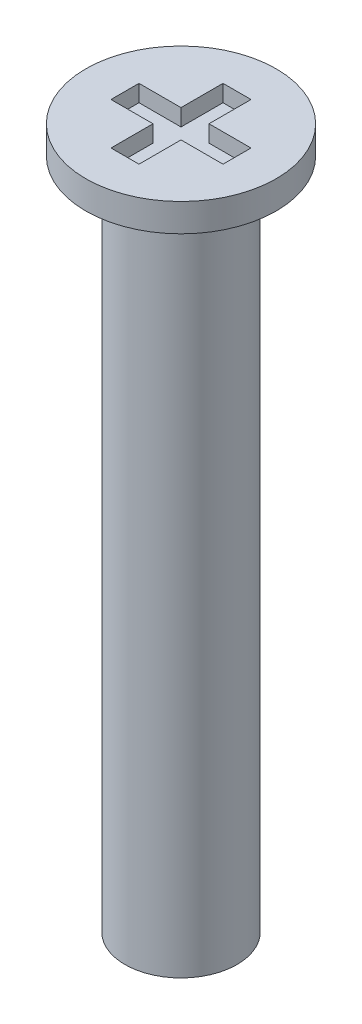
ISO-10303-21;
HEADER;
FILE_DESCRIPTION(('STEP AP214'),'2;1');
FILE_NAME('part.step','',(''),(''),'','','');
FILE_SCHEMA(('AUTOMOTIVE_DESIGN { 1 0 10303 214 1 1 1 1 }'));
ENDSEC;
DATA;
#1=APPLICATION_CONTEXT('core data for automotive mechanical design processes');
#2=APPLICATION_PROTOCOL_DEFINITION('international standard','automotive_design',2000,#1);
#3=PRODUCT_CONTEXT('',#1,'mechanical');
#4=PRODUCT('Part','Part','',(#3));
#5=PRODUCT_RELATED_PRODUCT_CATEGORY('part','',(#4));
#6=PRODUCT_DEFINITION_FORMATION('','',#4);
#7=PRODUCT_DEFINITION_CONTEXT('part definition',#1,'design');
#8=PRODUCT_DEFINITION('design','',#6,#7);
#9=PRODUCT_DEFINITION_SHAPE('','',#8);
#10=(LENGTH_UNIT() NAMED_UNIT(*) SI_UNIT(.MILLI.,.METRE.));
#11=(NAMED_UNIT(*) PLANE_ANGLE_UNIT() SI_UNIT($,.RADIAN.));
#12=(NAMED_UNIT(*) SI_UNIT($,.STERADIAN.) SOLID_ANGLE_UNIT());
#13=UNCERTAINTY_MEASURE_WITH_UNIT(LENGTH_MEASURE(1.E-05),#10,'distance_accuracy_value','');
#14=(GEOMETRIC_REPRESENTATION_CONTEXT(3) GLOBAL_UNCERTAINTY_ASSIGNED_CONTEXT((#13)) GLOBAL_UNIT_ASSIGNED_CONTEXT((#10,
#11,#12)) REPRESENTATION_CONTEXT('',''));
#15=CARTESIAN_POINT('',(0.,0.,0.));
#16=DIRECTION('',(0.,0.,1.));
#17=DIRECTION('',(1.,0.,0.));
#18=AXIS2_PLACEMENT_3D('',#15,#16,#17);
#19=CARTESIAN_POINT('',(0.,0.,0.));
#20=DIRECTION('',(0.,1.,0.));
#21=DIRECTION('',(0.,0.,1.));
#22=AXIS2_PLACEMENT_3D('',#19,#20,#21);
#23=PLANE('',#22);
#24=DIRECTION('',(-1.,0.,0.));
#25=VECTOR('',#24,1.);
#26=CARTESIAN_POINT('',(0.,0.,-0.25));
#27=LINE('',#26,#25);
#28=CARTESIAN_POINT('',(1.,0.,-0.249999999999997));
#29=VERTEX_POINT('',#28);
#30=CARTESIAN_POINT('',(0.25,0.,-0.249999999999999));
#31=VERTEX_POINT('',#30);
#32=EDGE_CURVE('E192',#29,#31,#27,.T.);
#33=ORIENTED_EDGE('',*,*,#32,.F.);
#34=DIRECTION('',(0.,0.,-1.));
#35=VECTOR('',#34,1.);
#36=CARTESIAN_POINT('',(1.,0.,-0.249999999999997));
#37=LINE('',#36,#35);
#38=CARTESIAN_POINT('',(0.999999999999999,0.,0.250000000000003));
#39=VERTEX_POINT('',#38);
#40=EDGE_CURVE('E138',#39,#29,#37,.T.);
#41=ORIENTED_EDGE('',*,*,#40,.F.);
#42=DIRECTION('',(1.,0.,0.));
#43=VECTOR('',#42,1.);
#44=CARTESIAN_POINT('',(0.,0.,0.25));
#45=LINE('',#44,#43);
#46=CARTESIAN_POINT('',(0.25,0.,0.250000000000003));
#47=VERTEX_POINT('',#46);
#48=EDGE_CURVE('E194',#47,#39,#45,.T.);
#49=ORIENTED_EDGE('',*,*,#48,.F.);
#50=DIRECTION('',(0.,0.,-1.));
#51=VECTOR('',#50,1.);
#52=CARTESIAN_POINT('',(0.25,0.,0.));
#53=LINE('',#52,#51);
#54=CARTESIAN_POINT('',(0.25,0.,1.));
#55=VERTEX_POINT('',#54);
#56=EDGE_CURVE('E164',#55,#47,#53,.T.);
#57=ORIENTED_EDGE('',*,*,#56,.F.);
#58=DIRECTION('',(1.,0.,0.));
#59=VECTOR('',#58,1.);
#60=CARTESIAN_POINT('',(0.25,0.,1.));
#61=LINE('',#60,#59);
#62=CARTESIAN_POINT('',(-0.25,0.,1.));
#63=VERTEX_POINT('',#62);
#64=EDGE_CURVE('E168',#63,#55,#61,.T.);
#65=ORIENTED_EDGE('',*,*,#64,.F.);
#66=DIRECTION('',(0.,0.,1.));
#67=VECTOR('',#66,1.);
#68=CARTESIAN_POINT('',(-0.25,0.,0.));
#69=LINE('',#68,#67);
#70=CARTESIAN_POINT('',(-0.25,0.,0.249999999999998));
#71=VERTEX_POINT('',#70);
#72=EDGE_CURVE('E176',#71,#63,#69,.T.);
#73=ORIENTED_EDGE('',*,*,#72,.F.);
#74=DIRECTION('',(1.,0.,0.));
#75=VECTOR('',#74,1.);
#76=CARTESIAN_POINT('',(0.,0.,0.25));
#77=LINE('',#76,#75);
#78=CARTESIAN_POINT('',(-1.,0.,0.24999999999999));
#79=VERTEX_POINT('',#78);
#80=EDGE_CURVE('E157',#79,#71,#77,.T.);
#81=ORIENTED_EDGE('',*,*,#80,.F.);
#82=DIRECTION('',(0.,0.,1.));
#83=VECTOR('',#82,1.);
#84=CARTESIAN_POINT('',(-1.,0.,0.24999999999999));
#85=LINE('',#84,#83);
#86=CARTESIAN_POINT('',(-0.999999999999997,0.,-0.25000000000001));
#87=VERTEX_POINT('',#86);
#88=EDGE_CURVE('E154',#87,#79,#85,.T.);
#89=ORIENTED_EDGE('',*,*,#88,.F.);
#90=CARTESIAN_POINT('',(-0.25,0.,-0.250000000000001));
#91=VERTEX_POINT('',#90);
#92=EDGE_CURVE('E144',#91,#87,#27,.T.);
#93=ORIENTED_EDGE('',*,*,#92,.F.);
#94=DIRECTION('',(0.,0.,1.));
#95=VECTOR('',#94,1.);
#96=CARTESIAN_POINT('',(-0.25,0.,0.));
#97=LINE('',#96,#95);
#98=CARTESIAN_POINT('',(-0.25,0.,-1.));
#99=VERTEX_POINT('',#98);
#100=EDGE_CURVE('E206',#99,#91,#97,.T.);
#101=ORIENTED_EDGE('',*,*,#100,.F.);
#102=DIRECTION('',(-1.,0.,0.));
#103=VECTOR('',#102,1.);
#104=CARTESIAN_POINT('',(-0.25,0.,-1.));
#105=LINE('',#104,#103);
#106=CARTESIAN_POINT('',(0.25,0.,-1.));
#107=VERTEX_POINT('',#106);
#108=EDGE_CURVE('E209',#107,#99,#105,.T.);
#109=ORIENTED_EDGE('',*,*,#108,.F.);
#110=DIRECTION('',(0.,0.,-1.));
#111=VECTOR('',#110,1.);
#112=CARTESIAN_POINT('',(0.25,0.,0.));
#113=LINE('',#112,#111);
#114=EDGE_CURVE('E64',#31,#107,#113,.T.);
#115=ORIENTED_EDGE('',*,*,#114,.F.);
#116=EDGE_LOOP('',(#33,#41,#49,#57,#65,#73,#81,#89,#93,#101,#109,#115));
#117=FACE_BOUND('',#116,.T.);
#118=CARTESIAN_POINT('',(0.,0.,0.));
#119=DIRECTION('',(0.,-1.,0.));
#120=DIRECTION('',(0.,0.,-1.));
#121=AXIS2_PLACEMENT_3D('',#118,#119,#120);
#122=CIRCLE('',#121,1.7);
#123=CARTESIAN_POINT('',(0.,0.,-1.7));
#124=VERTEX_POINT('',#123);
#125=EDGE_CURVE('E11',#124,#124,#122,.T.);
#126=ORIENTED_EDGE('',*,*,#125,.F.);
#127=EDGE_LOOP('',(#126));
#128=FACE_BOUND('',#127,.T.);
#129=ADVANCED_FACE('F36',(#117,#128),#23,.T.);
#130=CARTESIAN_POINT('',(0.,-12.5,0.));
#131=DIRECTION('',(0.,-1.,0.));
#132=DIRECTION('',(0.,0.,-1.));
#133=AXIS2_PLACEMENT_3D('',#130,#131,#132);
#134=CYLINDRICAL_SURFACE('',#133,1.7);
#135=ORIENTED_EDGE('',*,*,#125,.T.);
#136=EDGE_LOOP('',(#135));
#137=FACE_BOUND('',#136,.T.);
#138=CARTESIAN_POINT('',(0.,-0.5,0.));
#139=DIRECTION('',(0.,-1.,0.));
#140=DIRECTION('',(0.,0.,-1.));
#141=AXIS2_PLACEMENT_3D('',#138,#139,#140);
#142=CIRCLE('',#141,1.7);
#143=CARTESIAN_POINT('',(0.,-0.5,-1.7));
#144=VERTEX_POINT('',#143);
#145=EDGE_CURVE('E44',#144,#144,#142,.T.);
#146=ORIENTED_EDGE('',*,*,#145,.F.);
#147=EDGE_LOOP('',(#146));
#148=FACE_BOUND('',#147,.T.);
#149=ADVANCED_FACE('F231',(#137,#148),#134,.T.);
#150=CARTESIAN_POINT('',(1.7,-0.5,0.));
#151=DIRECTION('',(0.,-1.,0.));
#152=DIRECTION('',(0.,0.,-1.));
#153=AXIS2_PLACEMENT_3D('',#150,#151,#152);
#154=PLANE('',#153);
#155=ORIENTED_EDGE('',*,*,#145,.T.);
#156=EDGE_LOOP('',(#155));
#157=FACE_BOUND('',#156,.T.);
#158=CARTESIAN_POINT('',(0.,-0.5,0.));
#159=DIRECTION('',(0.,-1.,0.));
#160=DIRECTION('',(0.,0.,-1.));
#161=AXIS2_PLACEMENT_3D('',#158,#159,#160);
#162=CIRCLE('',#161,1.);
#163=CARTESIAN_POINT('',(0.,-0.5,-1.));
#164=VERTEX_POINT('',#163);
#165=EDGE_CURVE('E223',#164,#164,#162,.T.);
#166=ORIENTED_EDGE('',*,*,#165,.F.);
#167=EDGE_LOOP('',(#166));
#168=FACE_BOUND('',#167,.T.);
#169=ADVANCED_FACE('F228',(#157,#168),#154,.T.);
#170=CARTESIAN_POINT('',(0.,-12.5,0.));
#171=DIRECTION('',(0.,-1.,0.));
#172=DIRECTION('',(0.,0.,-1.));
#173=AXIS2_PLACEMENT_3D('',#170,#171,#172);
#174=CYLINDRICAL_SURFACE('',#173,1.);
#175=ORIENTED_EDGE('',*,*,#165,.T.);
#176=EDGE_LOOP('',(#175));
#177=FACE_BOUND('',#176,.T.);
#178=CARTESIAN_POINT('',(0.,-12.5,0.));
#179=DIRECTION('',(0.,-1.,0.));
#180=DIRECTION('',(0.,0.,-1.));
#181=AXIS2_PLACEMENT_3D('',#178,#179,#180);
#182=CIRCLE('',#181,1.);
#183=CARTESIAN_POINT('',(0.,-12.5,-1.));
#184=VERTEX_POINT('',#183);
#185=EDGE_CURVE('E219',#184,#184,#182,.T.);
#186=ORIENTED_EDGE('',*,*,#185,.F.);
#187=EDGE_LOOP('',(#186));
#188=FACE_BOUND('',#187,.T.);
#189=ADVANCED_FACE('F238',(#177,#188),#174,.T.);
#190=CARTESIAN_POINT('',(1.,-12.5,0.));
#191=DIRECTION('',(0.,-1.,0.));
#192=DIRECTION('',(0.,0.,-1.));
#193=AXIS2_PLACEMENT_3D('',#190,#191,#192);
#194=PLANE('',#193);
#195=ORIENTED_EDGE('',*,*,#185,.T.);
#196=EDGE_LOOP('',(#195));
#197=FACE_BOUND('',#196,.T.);
#198=ADVANCED_FACE('F244',(#197),#194,.T.);
#199=CARTESIAN_POINT('',(-0.25,-0.3,0.));
#200=DIRECTION('',(-1.,0.,0.));
#201=DIRECTION('',(0.,-1.,0.));
#202=AXIS2_PLACEMENT_3D('',#199,#200,#201);
#203=PLANE('',#202);
#204=ORIENTED_EDGE('',*,*,#100,.T.);
#205=DIRECTION('',(0.,-1.,0.));
#206=VECTOR('',#205,1.);
#207=CARTESIAN_POINT('',(-0.25,-0.3,-0.250000000000001));
#208=LINE('',#207,#206);
#209=CARTESIAN_POINT('',(-0.25,-0.3,-0.250000000000001));
#210=VERTEX_POINT('',#209);
#211=EDGE_CURVE('E204',#91,#210,#208,.T.);
#212=ORIENTED_EDGE('',*,*,#211,.T.);
#213=DIRECTION('',(0.,0.,1.));
#214=VECTOR('',#213,1.);
#215=CARTESIAN_POINT('',(-0.25,-0.3,0.));
#216=LINE('',#215,#214);
#217=CARTESIAN_POINT('',(-0.25,-0.3,-1.));
#218=VERTEX_POINT('',#217);
#219=EDGE_CURVE('E136',#218,#210,#216,.T.);
#220=ORIENTED_EDGE('',*,*,#219,.F.);
#221=DIRECTION('',(0.,1.,0.));
#222=VECTOR('',#221,1.);
#223=CARTESIAN_POINT('',(-0.25,-0.3,-1.));
#224=LINE('',#223,#222);
#225=EDGE_CURVE('E52',#218,#99,#224,.T.);
#226=ORIENTED_EDGE('',*,*,#225,.T.);
#227=EDGE_LOOP('',(#204,#212,#220,#226));
#228=FACE_BOUND('',#227,.T.);
#229=ADVANCED_FACE('F248',(#228),#203,.F.);
#230=CARTESIAN_POINT('',(-0.25,-0.3,-1.));
#231=DIRECTION('',(0.,0.,-1.));
#232=DIRECTION('',(-1.,0.,0.));
#233=AXIS2_PLACEMENT_3D('',#230,#231,#232);
#234=PLANE('',#233);
#235=ORIENTED_EDGE('',*,*,#108,.T.);
#236=ORIENTED_EDGE('',*,*,#225,.F.);
#237=DIRECTION('',(-1.,0.,0.));
#238=VECTOR('',#237,1.);
#239=CARTESIAN_POINT('',(-0.25,-0.3,-1.));
#240=LINE('',#239,#238);
#241=CARTESIAN_POINT('',(0.25,-0.3,-1.));
#242=VERTEX_POINT('',#241);
#243=EDGE_CURVE('E211',#242,#218,#240,.T.);
#244=ORIENTED_EDGE('',*,*,#243,.F.);
#245=DIRECTION('',(0.,1.,0.));
#246=VECTOR('',#245,1.);
#247=CARTESIAN_POINT('',(0.25,-0.3,-1.));
#248=LINE('',#247,#246);
#249=EDGE_CURVE('E213',#242,#107,#248,.T.);
#250=ORIENTED_EDGE('',*,*,#249,.T.);
#251=EDGE_LOOP('',(#235,#236,#244,#250));
#252=FACE_BOUND('',#251,.T.);
#253=ADVANCED_FACE('F252',(#252),#234,.F.);
#254=CARTESIAN_POINT('',(0.25,-0.3,0.));
#255=DIRECTION('',(1.,0.,0.));
#256=DIRECTION('',(0.,1.,0.));
#257=AXIS2_PLACEMENT_3D('',#254,#255,#256);
#258=PLANE('',#257);
#259=DIRECTION('',(0.,0.,-1.));
#260=VECTOR('',#259,1.);
#261=CARTESIAN_POINT('',(0.25,-0.3,0.));
#262=LINE('',#261,#260);
#263=CARTESIAN_POINT('',(0.25,-0.3,-0.249999999999999));
#264=VERTEX_POINT('',#263);
#265=EDGE_CURVE('E208',#264,#242,#262,.T.);
#266=ORIENTED_EDGE('',*,*,#265,.F.);
#267=DIRECTION('',(0.,1.,0.));
#268=VECTOR('',#267,1.);
#269=CARTESIAN_POINT('',(0.25,-0.3,-0.249999999999999));
#270=LINE('',#269,#268);
#271=EDGE_CURVE('E200',#264,#31,#270,.T.);
#272=ORIENTED_EDGE('',*,*,#271,.T.);
#273=ORIENTED_EDGE('',*,*,#114,.T.);
#274=ORIENTED_EDGE('',*,*,#249,.F.);
#275=EDGE_LOOP('',(#266,#272,#273,#274));
#276=FACE_BOUND('',#275,.T.);
#277=ADVANCED_FACE('F254',(#276),#258,.F.);
#278=CARTESIAN_POINT('',(0.,-0.3,0.));
#279=DIRECTION('',(0.,-1.,0.));
#280=DIRECTION('',(1.,0.,0.));
#281=AXIS2_PLACEMENT_3D('',#278,#279,#280);
#282=PLANE('',#281);
#283=DIRECTION('',(-1.,0.,0.));
#284=VECTOR('',#283,1.);
#285=CARTESIAN_POINT('',(0.,-0.3,-0.25));
#286=LINE('',#285,#284);
#287=CARTESIAN_POINT('',(1.,-0.3,-0.249999999999997));
#288=VERTEX_POINT('',#287);
#289=EDGE_CURVE('E137',#288,#264,#286,.T.);
#290=ORIENTED_EDGE('',*,*,#289,.T.);
#291=ORIENTED_EDGE('',*,*,#265,.T.);
#292=ORIENTED_EDGE('',*,*,#243,.T.);
#293=ORIENTED_EDGE('',*,*,#219,.T.);
#294=CARTESIAN_POINT('',(-0.999999999999997,-0.3,-0.25000000000001));
#295=VERTEX_POINT('',#294);
#296=EDGE_CURVE('E72',#210,#295,#286,.T.);
#297=ORIENTED_EDGE('',*,*,#296,.T.);
#298=DIRECTION('',(0.,0.,1.));
#299=VECTOR('',#298,1.);
#300=CARTESIAN_POINT('',(-1.,-0.3,0.24999999999999));
#301=LINE('',#300,#299);
#302=CARTESIAN_POINT('',(-1.,-0.3,0.24999999999999));
#303=VERTEX_POINT('',#302);
#304=EDGE_CURVE('E134',#295,#303,#301,.T.);
#305=ORIENTED_EDGE('',*,*,#304,.T.);
#306=DIRECTION('',(1.,0.,0.));
#307=VECTOR('',#306,1.);
#308=CARTESIAN_POINT('',(0.,-0.3,0.25));
#309=LINE('',#308,#307);
#310=CARTESIAN_POINT('',(-0.25,-0.3,0.249999999999998));
#311=VERTEX_POINT('',#310);
#312=EDGE_CURVE('E152',#303,#311,#309,.T.);
#313=ORIENTED_EDGE('',*,*,#312,.T.);
#314=DIRECTION('',(0.,0.,1.));
#315=VECTOR('',#314,1.);
#316=CARTESIAN_POINT('',(-0.25,-0.3,0.));
#317=LINE('',#316,#315);
#318=CARTESIAN_POINT('',(-0.25,-0.3,1.));
#319=VERTEX_POINT('',#318);
#320=EDGE_CURVE('E167',#311,#319,#317,.T.);
#321=ORIENTED_EDGE('',*,*,#320,.T.);
#322=DIRECTION('',(1.,0.,0.));
#323=VECTOR('',#322,1.);
#324=CARTESIAN_POINT('',(0.25,-0.3,1.));
#325=LINE('',#324,#323);
#326=CARTESIAN_POINT('',(0.25,-0.3,1.));
#327=VERTEX_POINT('',#326);
#328=EDGE_CURVE('E170',#319,#327,#325,.T.);
#329=ORIENTED_EDGE('',*,*,#328,.T.);
#330=DIRECTION('',(0.,0.,-1.));
#331=VECTOR('',#330,1.);
#332=CARTESIAN_POINT('',(0.25,-0.3,0.));
#333=LINE('',#332,#331);
#334=CARTESIAN_POINT('',(0.25,-0.3,0.250000000000003));
#335=VERTEX_POINT('',#334);
#336=EDGE_CURVE('E165',#327,#335,#333,.T.);
#337=ORIENTED_EDGE('',*,*,#336,.T.);
#338=DIRECTION('',(1.,0.,0.));
#339=VECTOR('',#338,1.);
#340=CARTESIAN_POINT('',(0.,-0.3,0.25));
#341=LINE('',#340,#339);
#342=CARTESIAN_POINT('',(0.999999999999999,-0.3,0.250000000000003));
#343=VERTEX_POINT('',#342);
#344=EDGE_CURVE('E186',#335,#343,#341,.T.);
#345=ORIENTED_EDGE('',*,*,#344,.T.);
#346=DIRECTION('',(0.,0.,-1.));
#347=VECTOR('',#346,1.);
#348=CARTESIAN_POINT('',(1.,-0.3,-0.249999999999997));
#349=LINE('',#348,#347);
#350=EDGE_CURVE('E188',#343,#288,#349,.T.);
#351=ORIENTED_EDGE('',*,*,#350,.T.);
#352=EDGE_LOOP('',(#290,#291,#292,#293,#297,#305,#313,#321,#329,#337,#345,#351));
#353=FACE_BOUND('',#352,.T.);
#354=ADVANCED_FACE('F132',(#353),#282,.F.);
#355=CARTESIAN_POINT('',(0.,-0.3,-0.25));
#356=DIRECTION('',(0.,0.,-1.));
#357=DIRECTION('',(-1.,0.,0.));
#358=AXIS2_PLACEMENT_3D('',#355,#356,#357);
#359=PLANE('',#358);
#360=ORIENTED_EDGE('',*,*,#92,.T.);
#361=DIRECTION('',(0.,1.,0.));
#362=VECTOR('',#361,1.);
#363=CARTESIAN_POINT('',(-0.999999999999997,-0.3,-0.25000000000001));
#364=LINE('',#363,#362);
#365=EDGE_CURVE('E141',#295,#87,#364,.T.);
#366=ORIENTED_EDGE('',*,*,#365,.F.);
#367=ORIENTED_EDGE('',*,*,#296,.F.);
#368=ORIENTED_EDGE('',*,*,#211,.F.);
#369=EDGE_LOOP('',(#360,#366,#367,#368));
#370=FACE_BOUND('',#369,.T.);
#371=ADVANCED_FACE('F142',(#370),#359,.F.);
#372=ORIENTED_EDGE('',*,*,#289,.F.);
#373=DIRECTION('',(0.,1.,0.));
#374=VECTOR('',#373,1.);
#375=CARTESIAN_POINT('',(1.,-0.3,-0.249999999999997));
#376=LINE('',#375,#374);
#377=EDGE_CURVE('E198',#288,#29,#376,.T.);
#378=ORIENTED_EDGE('',*,*,#377,.T.);
#379=ORIENTED_EDGE('',*,*,#32,.T.);
#380=ORIENTED_EDGE('',*,*,#271,.F.);
#381=EDGE_LOOP('',(#372,#378,#379,#380));
#382=FACE_BOUND('',#381,.T.);
#383=ADVANCED_FACE('F263',(#382),#359,.F.);
#384=CARTESIAN_POINT('',(1.,-0.3,-0.249999999999997));
#385=DIRECTION('',(1.,0.,0.));
#386=DIRECTION('',(0.,0.,-1.));
#387=AXIS2_PLACEMENT_3D('',#384,#385,#386);
#388=PLANE('',#387);
#389=ORIENTED_EDGE('',*,*,#40,.T.);
#390=ORIENTED_EDGE('',*,*,#377,.F.);
#391=ORIENTED_EDGE('',*,*,#350,.F.);
#392=DIRECTION('',(0.,1.,0.));
#393=VECTOR('',#392,1.);
#394=CARTESIAN_POINT('',(0.999999999999999,-0.3,0.250000000000003));
#395=LINE('',#394,#393);
#396=EDGE_CURVE('E191',#343,#39,#395,.T.);
#397=ORIENTED_EDGE('',*,*,#396,.T.);
#398=EDGE_LOOP('',(#389,#390,#391,#397));
#399=FACE_BOUND('',#398,.T.);
#400=ADVANCED_FACE('F268',(#399),#388,.F.);
#401=CARTESIAN_POINT('',(0.,-0.3,0.25));
#402=DIRECTION('',(0.,0.,1.));
#403=DIRECTION('',(1.,0.,0.));
#404=AXIS2_PLACEMENT_3D('',#401,#402,#403);
#405=PLANE('',#404);
#406=DIRECTION('',(0.,1.,0.));
#407=VECTOR('',#406,1.);
#408=CARTESIAN_POINT('',(0.25,-0.3,0.250000000000001));
#409=LINE('',#408,#407);
#410=EDGE_CURVE('E182',#335,#47,#409,.T.);
#411=ORIENTED_EDGE('',*,*,#410,.T.);
#412=ORIENTED_EDGE('',*,*,#48,.T.);
#413=ORIENTED_EDGE('',*,*,#396,.F.);
#414=ORIENTED_EDGE('',*,*,#344,.F.);
#415=EDGE_LOOP('',(#411,#412,#413,#414));
#416=FACE_BOUND('',#415,.T.);
#417=ADVANCED_FACE('F264',(#416),#405,.F.);
#418=CARTESIAN_POINT('',(0.25,-0.3,0.));
#419=DIRECTION('',(1.,0.,0.));
#420=DIRECTION('',(0.,1.,0.));
#421=AXIS2_PLACEMENT_3D('',#418,#419,#420);
#422=PLANE('',#421);
#423=ORIENTED_EDGE('',*,*,#336,.F.);
#424=DIRECTION('',(0.,1.,0.));
#425=VECTOR('',#424,1.);
#426=CARTESIAN_POINT('',(0.25,-0.3,1.));
#427=LINE('',#426,#425);
#428=EDGE_CURVE('E180',#327,#55,#427,.T.);
#429=ORIENTED_EDGE('',*,*,#428,.T.);
#430=ORIENTED_EDGE('',*,*,#56,.T.);
#431=ORIENTED_EDGE('',*,*,#410,.F.);
#432=EDGE_LOOP('',(#423,#429,#430,#431));
#433=FACE_BOUND('',#432,.T.);
#434=ADVANCED_FACE('F267',(#433),#422,.F.);
#435=CARTESIAN_POINT('',(0.25,-0.3,1.));
#436=DIRECTION('',(0.,0.,1.));
#437=DIRECTION('',(1.,0.,0.));
#438=AXIS2_PLACEMENT_3D('',#435,#436,#437);
#439=PLANE('',#438);
#440=ORIENTED_EDGE('',*,*,#64,.T.);
#441=ORIENTED_EDGE('',*,*,#428,.F.);
#442=ORIENTED_EDGE('',*,*,#328,.F.);
#443=DIRECTION('',(0.,1.,0.));
#444=VECTOR('',#443,1.);
#445=CARTESIAN_POINT('',(-0.25,-0.3,1.));
#446=LINE('',#445,#444);
#447=EDGE_CURVE('E173',#319,#63,#446,.T.);
#448=ORIENTED_EDGE('',*,*,#447,.T.);
#449=EDGE_LOOP('',(#440,#441,#442,#448));
#450=FACE_BOUND('',#449,.T.);
#451=ADVANCED_FACE('F275',(#450),#439,.F.);
#452=CARTESIAN_POINT('',(-0.25,-0.3,0.));
#453=DIRECTION('',(-1.,0.,0.));
#454=DIRECTION('',(0.,-1.,0.));
#455=AXIS2_PLACEMENT_3D('',#452,#453,#454);
#456=PLANE('',#455);
#457=DIRECTION('',(0.,1.,0.));
#458=VECTOR('',#457,1.);
#459=CARTESIAN_POINT('',(-0.25,-0.3,0.249999999999998));
#460=LINE('',#459,#458);
#461=EDGE_CURVE('E161',#311,#71,#460,.T.);
#462=ORIENTED_EDGE('',*,*,#461,.T.);
#463=ORIENTED_EDGE('',*,*,#72,.T.);
#464=ORIENTED_EDGE('',*,*,#447,.F.);
#465=ORIENTED_EDGE('',*,*,#320,.F.);
#466=EDGE_LOOP('',(#462,#463,#464,#465));
#467=FACE_BOUND('',#466,.T.);
#468=ADVANCED_FACE('F277',(#467),#456,.F.);
#469=CARTESIAN_POINT('',(0.,-0.3,0.25));
#470=DIRECTION('',(0.,0.,1.));
#471=DIRECTION('',(1.,0.,0.));
#472=AXIS2_PLACEMENT_3D('',#469,#470,#471);
#473=PLANE('',#472);
#474=ORIENTED_EDGE('',*,*,#312,.F.);
#475=DIRECTION('',(0.,1.,0.));
#476=VECTOR('',#475,1.);
#477=CARTESIAN_POINT('',(-1.,-0.3,0.24999999999999));
#478=LINE('',#477,#476);
#479=EDGE_CURVE('E148',#303,#79,#478,.T.);
#480=ORIENTED_EDGE('',*,*,#479,.T.);
#481=ORIENTED_EDGE('',*,*,#80,.T.);
#482=ORIENTED_EDGE('',*,*,#461,.F.);
#483=EDGE_LOOP('',(#474,#480,#481,#482));
#484=FACE_BOUND('',#483,.T.);
#485=ADVANCED_FACE('F280',(#484),#473,.F.);
#486=CARTESIAN_POINT('',(-1.,-0.3,0.24999999999999));
#487=DIRECTION('',(-1.,0.,0.));
#488=DIRECTION('',(0.,0.,1.));
#489=AXIS2_PLACEMENT_3D('',#486,#487,#488);
#490=PLANE('',#489);
#491=ORIENTED_EDGE('',*,*,#88,.T.);
#492=ORIENTED_EDGE('',*,*,#479,.F.);
#493=ORIENTED_EDGE('',*,*,#304,.F.);
#494=ORIENTED_EDGE('',*,*,#365,.T.);
#495=EDGE_LOOP('',(#491,#492,#493,#494));
#496=FACE_BOUND('',#495,.T.);
#497=ADVANCED_FACE('F150',(#496),#490,.F.);
#498=CLOSED_SHELL('',(#129,#149,#169,#189,#198,#229,#253,#277,#354,#371,#383,#400,#417,#434,
#451,#468,#485,#497));
#499=MANIFOLD_SOLID_BREP('B2',#498);
#500=ADVANCED_BREP_SHAPE_REPRESENTATION('',(#18,#499),#14);
#501=SHAPE_DEFINITION_REPRESENTATION(#9,#500);
ENDSEC;
END-ISO-10303-21;
